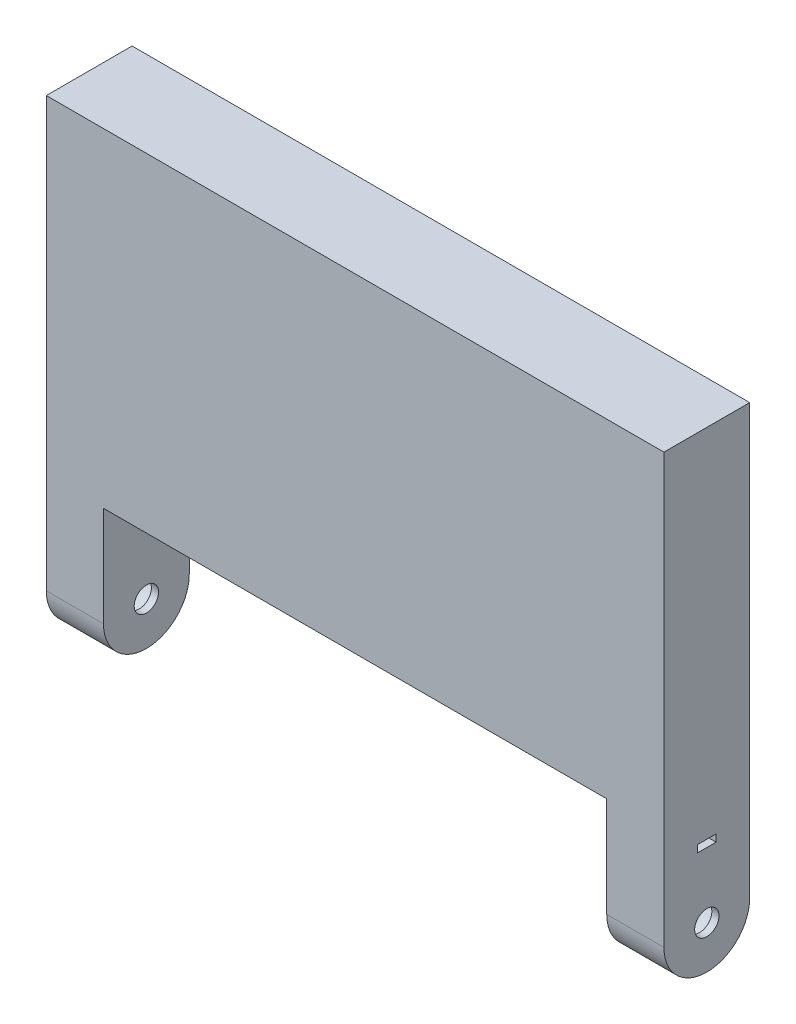
ISO-10303-21;
HEADER;
FILE_DESCRIPTION(('STEP AP214'),'2;1');
FILE_NAME('part.step','',(''),(''),'','','');
FILE_SCHEMA(('AUTOMOTIVE_DESIGN { 1 0 10303 214 1 1 1 1 }'));
ENDSEC;
DATA;
#1=APPLICATION_CONTEXT('core data for automotive mechanical design processes');
#2=APPLICATION_PROTOCOL_DEFINITION('international standard','automotive_design',2000,#1);
#3=PRODUCT_CONTEXT('',#1,'mechanical');
#4=PRODUCT('Part','Part','',(#3));
#5=PRODUCT_RELATED_PRODUCT_CATEGORY('part','',(#4));
#6=PRODUCT_DEFINITION_FORMATION('','',#4);
#7=PRODUCT_DEFINITION_CONTEXT('part definition',#1,'design');
#8=PRODUCT_DEFINITION('design','',#6,#7);
#9=PRODUCT_DEFINITION_SHAPE('','',#8);
#10=(LENGTH_UNIT() NAMED_UNIT(*) SI_UNIT(.MILLI.,.METRE.));
#11=(NAMED_UNIT(*) PLANE_ANGLE_UNIT() SI_UNIT($,.RADIAN.));
#12=(NAMED_UNIT(*) SI_UNIT($,.STERADIAN.) SOLID_ANGLE_UNIT());
#13=UNCERTAINTY_MEASURE_WITH_UNIT(LENGTH_MEASURE(1.E-05),#10,'distance_accuracy_value','');
#14=(GEOMETRIC_REPRESENTATION_CONTEXT(3) GLOBAL_UNCERTAINTY_ASSIGNED_CONTEXT((#13)) GLOBAL_UNIT_ASSIGNED_CONTEXT((#10,
#11,#12)) REPRESENTATION_CONTEXT('',''));
#15=CARTESIAN_POINT('',(0.,0.,0.));
#16=DIRECTION('',(0.,0.,1.));
#17=DIRECTION('',(1.,0.,0.));
#18=AXIS2_PLACEMENT_3D('',#15,#16,#17);
#19=CARTESIAN_POINT('',(-176.,0.,0.));
#20=DIRECTION('',(1.,0.,0.));
#21=DIRECTION('',(0.,0.,-1.));
#22=AXIS2_PLACEMENT_3D('',#19,#20,#21);
#23=PLANE('',#22);
#24=CARTESIAN_POINT('',(-176.,0.,0.));
#25=DIRECTION('',(1.,0.,0.));
#26=DIRECTION('',(0.,0.,-1.));
#27=AXIS2_PLACEMENT_3D('',#24,#25,#26);
#28=CIRCLE('',#27,8.5);
#29=CARTESIAN_POINT('',(-176.,0.,-8.5));
#30=VERTEX_POINT('',#29);
#31=EDGE_CURVE('E313',#30,#30,#28,.T.);
#32=ORIENTED_EDGE('',*,*,#31,.F.);
#33=EDGE_LOOP('',(#32));
#34=FACE_BOUND('',#33,.T.);
#35=DIRECTION('',(0.,-1.,0.));
#36=VECTOR('',#35,1.);
#37=CARTESIAN_POINT('',(-176.,0.,-30.));
#38=LINE('',#37,#36);
#39=CARTESIAN_POINT('',(-176.,70.,-30.));
#40=VERTEX_POINT('',#39);
#41=CARTESIAN_POINT('',(-176.,0.,-30.));
#42=VERTEX_POINT('',#41);
#43=EDGE_CURVE('E322',#40,#42,#38,.T.);
#44=ORIENTED_EDGE('',*,*,#43,.F.);
#45=DIRECTION('',(0.,0.,1.));
#46=VECTOR('',#45,1.);
#47=CARTESIAN_POINT('',(-176.,70.,0.));
#48=LINE('',#47,#46);
#49=CARTESIAN_POINT('',(-176.,70.,30.));
#50=VERTEX_POINT('',#49);
#51=EDGE_CURVE('E202',#40,#50,#48,.T.);
#52=ORIENTED_EDGE('',*,*,#51,.T.);
#53=DIRECTION('',(0.,1.,0.));
#54=VECTOR('',#53,1.);
#55=CARTESIAN_POINT('',(-176.,0.,30.));
#56=LINE('',#55,#54);
#57=CARTESIAN_POINT('',(-176.,0.,30.));
#58=VERTEX_POINT('',#57);
#59=EDGE_CURVE('E324',#58,#50,#56,.T.);
#60=ORIENTED_EDGE('',*,*,#59,.F.);
#61=CARTESIAN_POINT('',(-176.,0.,0.));
#62=DIRECTION('',(1.,0.,0.));
#63=DIRECTION('',(0.,0.,-1.));
#64=AXIS2_PLACEMENT_3D('',#61,#62,#63);
#65=CIRCLE('',#64,30.);
#66=EDGE_CURVE('E319',#58,#42,#65,.T.);
#67=ORIENTED_EDGE('',*,*,#66,.T.);
#68=EDGE_LOOP('',(#44,#52,#60,#67));
#69=FACE_BOUND('',#68,.T.);
#70=ADVANCED_FACE('F35',(#34,#69),#23,.T.);
#71=CARTESIAN_POINT('',(-211.,0.,0.));
#72=DIRECTION('',(1.,0.,0.));
#73=DIRECTION('',(0.,0.,-1.));
#74=AXIS2_PLACEMENT_3D('',#71,#72,#73);
#75=PLANE('',#74);
#76=CARTESIAN_POINT('',(-211.,0.,0.));
#77=DIRECTION('',(1.,0.,0.));
#78=DIRECTION('',(0.,0.,-1.));
#79=AXIS2_PLACEMENT_3D('',#76,#77,#78);
#80=CIRCLE('',#79,8.5);
#81=CARTESIAN_POINT('',(-211.,0.,-8.5));
#82=VERTEX_POINT('',#81);
#83=EDGE_CURVE('E310',#82,#82,#80,.T.);
#84=ORIENTED_EDGE('',*,*,#83,.F.);
#85=EDGE_LOOP('',(#84));
#86=FACE_BOUND('',#85,.T.);
#87=DIRECTION('',(0.,-1.,0.));
#88=VECTOR('',#87,1.);
#89=CARTESIAN_POINT('',(-211.,0.,6.50000000000001));
#90=LINE('',#89,#88);
#91=CARTESIAN_POINT('',(-211.,50.5,6.50000000000001));
#92=VERTEX_POINT('',#91);
#93=CARTESIAN_POINT('',(-211.,45.5,6.50000000000001));
#94=VERTEX_POINT('',#93);
#95=EDGE_CURVE('E362',#92,#94,#90,.T.);
#96=ORIENTED_EDGE('',*,*,#95,.F.);
#97=DIRECTION('',(0.,0.,1.));
#98=VECTOR('',#97,1.);
#99=CARTESIAN_POINT('',(-211.,50.5,0.));
#100=LINE('',#99,#98);
#101=CARTESIAN_POINT('',(-211.,50.5,-6.49999999999999));
#102=VERTEX_POINT('',#101);
#103=EDGE_CURVE('E365',#102,#92,#100,.T.);
#104=ORIENTED_EDGE('',*,*,#103,.F.);
#105=DIRECTION('',(0.,-1.,0.));
#106=VECTOR('',#105,1.);
#107=CARTESIAN_POINT('',(-211.,0.,-6.49999999999999));
#108=LINE('',#107,#106);
#109=CARTESIAN_POINT('',(-211.,45.5,-6.49999999999999));
#110=VERTEX_POINT('',#109);
#111=EDGE_CURVE('E369',#102,#110,#108,.T.);
#112=ORIENTED_EDGE('',*,*,#111,.T.);
#113=DIRECTION('',(0.,0.,1.));
#114=VECTOR('',#113,1.);
#115=CARTESIAN_POINT('',(-211.,45.5,0.));
#116=LINE('',#115,#114);
#117=EDGE_CURVE('E372',#110,#94,#116,.T.);
#118=ORIENTED_EDGE('',*,*,#117,.T.);
#119=EDGE_LOOP('',(#96,#104,#112,#118));
#120=FACE_BOUND('',#119,.T.);
#121=CARTESIAN_POINT('',(-211.,0.,0.));
#122=DIRECTION('',(1.,0.,0.));
#123=DIRECTION('',(0.,0.,-1.));
#124=AXIS2_PLACEMENT_3D('',#121,#122,#123);
#125=CIRCLE('',#124,25.);
#126=CARTESIAN_POINT('',(-211.,0.,25.));
#127=VERTEX_POINT('',#126);
#128=CARTESIAN_POINT('',(-211.,0.,-25.));
#129=VERTEX_POINT('',#128);
#130=EDGE_CURVE('E346',#127,#129,#125,.T.);
#131=ORIENTED_EDGE('',*,*,#130,.T.);
#132=DIRECTION('',(0.,-1.,0.));
#133=VECTOR('',#132,1.);
#134=CARTESIAN_POINT('',(-211.,0.,-25.));
#135=LINE('',#134,#133);
#136=CARTESIAN_POINT('',(-211.,295.,-25.));
#137=VERTEX_POINT('',#136);
#138=EDGE_CURVE('E334',#137,#129,#135,.T.);
#139=ORIENTED_EDGE('',*,*,#138,.F.);
#140=DIRECTION('',(0.,0.,-1.));
#141=VECTOR('',#140,1.);
#142=CARTESIAN_POINT('',(-211.,295.,0.));
#143=LINE('',#142,#141);
#144=CARTESIAN_POINT('',(-211.,295.,25.));
#145=VERTEX_POINT('',#144);
#146=EDGE_CURVE('E339',#145,#137,#143,.T.);
#147=ORIENTED_EDGE('',*,*,#146,.F.);
#148=DIRECTION('',(0.,1.,0.));
#149=VECTOR('',#148,1.);
#150=CARTESIAN_POINT('',(-211.,0.,25.));
#151=LINE('',#150,#149);
#152=EDGE_CURVE('E349',#127,#145,#151,.T.);
#153=ORIENTED_EDGE('',*,*,#152,.F.);
#154=EDGE_LOOP('',(#131,#139,#147,#153));
#155=FACE_BOUND('',#154,.T.);
#156=ADVANCED_FACE('F432',(#86,#120,#155),#75,.T.);
#157=CARTESIAN_POINT('',(-211.,0.,6.50000000000001));
#158=DIRECTION('',(0.,0.,-1.));
#159=DIRECTION('',(0.,1.,0.));
#160=AXIS2_PLACEMENT_3D('',#157,#158,#159);
#161=PLANE('',#160);
#162=DIRECTION('',(0.,-1.,0.));
#163=VECTOR('',#162,1.);
#164=CARTESIAN_POINT('',(-216.,0.,6.50000000000001));
#165=LINE('',#164,#163);
#166=CARTESIAN_POINT('',(-216.,50.5,6.50000000000001));
#167=VERTEX_POINT('',#166);
#168=CARTESIAN_POINT('',(-216.,45.5,6.50000000000001));
#169=VERTEX_POINT('',#168);
#170=EDGE_CURVE('E386',#167,#169,#165,.T.);
#171=ORIENTED_EDGE('',*,*,#170,.F.);
#172=DIRECTION('',(-1.,0.,0.));
#173=VECTOR('',#172,1.);
#174=CARTESIAN_POINT('',(-211.,50.5,6.50000000000001));
#175=LINE('',#174,#173);
#176=EDGE_CURVE('E11',#92,#167,#175,.T.);
#177=ORIENTED_EDGE('',*,*,#176,.F.);
#178=ORIENTED_EDGE('',*,*,#95,.T.);
#179=DIRECTION('',(-1.,0.,0.));
#180=VECTOR('',#179,1.);
#181=CARTESIAN_POINT('',(-211.,45.5,6.50000000000001));
#182=LINE('',#181,#180);
#183=EDGE_CURVE('E397',#94,#169,#182,.T.);
#184=ORIENTED_EDGE('',*,*,#183,.T.);
#185=EDGE_LOOP('',(#171,#177,#178,#184));
#186=FACE_BOUND('',#185,.T.);
#187=ADVANCED_FACE('F438',(#186),#161,.T.);
#188=CARTESIAN_POINT('',(-211.,50.5,0.));
#189=DIRECTION('',(0.,-1.,0.));
#190=DIRECTION('',(0.,0.,-1.));
#191=AXIS2_PLACEMENT_3D('',#188,#189,#190);
#192=PLANE('',#191);
#193=DIRECTION('',(0.,0.,1.));
#194=VECTOR('',#193,1.);
#195=CARTESIAN_POINT('',(-216.,50.5,0.));
#196=LINE('',#195,#194);
#197=CARTESIAN_POINT('',(-216.,50.5,-6.49999999999999));
#198=VERTEX_POINT('',#197);
#199=EDGE_CURVE('E389',#198,#167,#196,.T.);
#200=ORIENTED_EDGE('',*,*,#199,.F.);
#201=DIRECTION('',(-1.,0.,0.));
#202=VECTOR('',#201,1.);
#203=CARTESIAN_POINT('',(-211.,50.5,-6.49999999999999));
#204=LINE('',#203,#202);
#205=EDGE_CURVE('E44',#102,#198,#204,.T.);
#206=ORIENTED_EDGE('',*,*,#205,.F.);
#207=ORIENTED_EDGE('',*,*,#103,.T.);
#208=ORIENTED_EDGE('',*,*,#176,.T.);
#209=EDGE_LOOP('',(#200,#206,#207,#208));
#210=FACE_BOUND('',#209,.T.);
#211=ADVANCED_FACE('F479',(#210),#192,.T.);
#212=CARTESIAN_POINT('',(-211.,0.,-6.49999999999999));
#213=DIRECTION('',(0.,0.,-1.));
#214=DIRECTION('',(-1.,0.,0.));
#215=AXIS2_PLACEMENT_3D('',#212,#213,#214);
#216=PLANE('',#215);
#217=DIRECTION('',(0.,-1.,0.));
#218=VECTOR('',#217,1.);
#219=CARTESIAN_POINT('',(-216.,0.,-6.49999999999999));
#220=LINE('',#219,#218);
#221=CARTESIAN_POINT('',(-216.,45.5,-6.49999999999999));
#222=VERTEX_POINT('',#221);
#223=EDGE_CURVE('E392',#198,#222,#220,.T.);
#224=ORIENTED_EDGE('',*,*,#223,.T.);
#225=DIRECTION('',(-1.,0.,0.));
#226=VECTOR('',#225,1.);
#227=CARTESIAN_POINT('',(-211.,45.5,-6.49999999999999));
#228=LINE('',#227,#226);
#229=EDGE_CURVE('E399',#110,#222,#228,.T.);
#230=ORIENTED_EDGE('',*,*,#229,.F.);
#231=ORIENTED_EDGE('',*,*,#111,.F.);
#232=ORIENTED_EDGE('',*,*,#205,.T.);
#233=EDGE_LOOP('',(#224,#230,#231,#232));
#234=FACE_BOUND('',#233,.T.);
#235=ADVANCED_FACE('F476',(#234),#216,.F.);
#236=CARTESIAN_POINT('',(-211.,0.,0.));
#237=DIRECTION('',(-1.,0.,0.));
#238=DIRECTION('',(0.,0.,1.));
#239=AXIS2_PLACEMENT_3D('',#236,#237,#238);
#240=CYLINDRICAL_SURFACE('',#239,30.);
#241=CARTESIAN_POINT('',(-216.,0.,0.));
#242=DIRECTION('',(1.,0.,0.));
#243=DIRECTION('',(0.,0.,-1.));
#244=AXIS2_PLACEMENT_3D('',#241,#242,#243);
#245=CIRCLE('',#244,30.);
#246=CARTESIAN_POINT('',(-216.,0.,30.));
#247=VERTEX_POINT('',#246);
#248=CARTESIAN_POINT('',(-216.,0.,-30.));
#249=VERTEX_POINT('',#248);
#250=EDGE_CURVE('E361',#247,#249,#245,.T.);
#251=ORIENTED_EDGE('',*,*,#250,.T.);
#252=DIRECTION('',(-1.,0.,0.));
#253=VECTOR('',#252,1.);
#254=CARTESIAN_POINT('',(-211.,0.,-30.));
#255=LINE('',#254,#253);
#256=EDGE_CURVE('E400',#42,#249,#255,.T.);
#257=ORIENTED_EDGE('',*,*,#256,.F.);
#258=ORIENTED_EDGE('',*,*,#66,.F.);
#259=DIRECTION('',(-1.,0.,0.));
#260=VECTOR('',#259,1.);
#261=CARTESIAN_POINT('',(-211.,0.,30.));
#262=LINE('',#261,#260);
#263=EDGE_CURVE('E374',#58,#247,#262,.T.);
#264=ORIENTED_EDGE('',*,*,#263,.T.);
#265=EDGE_LOOP('',(#251,#257,#258,#264));
#266=FACE_BOUND('',#265,.T.);
#267=ADVANCED_FACE('F37',(#266),#240,.T.);
#268=CARTESIAN_POINT('',(-211.,0.,-30.));
#269=DIRECTION('',(0.,0.,-1.));
#270=DIRECTION('',(-1.,0.,0.));
#271=AXIS2_PLACEMENT_3D('',#268,#269,#270);
#272=PLANE('',#271);
#273=DIRECTION('',(0.,-1.,0.));
#274=VECTOR('',#273,1.);
#275=CARTESIAN_POINT('',(-216.,0.,-30.));
#276=LINE('',#275,#274);
#277=CARTESIAN_POINT('',(-216.,300.,-30.));
#278=VERTEX_POINT('',#277);
#279=EDGE_CURVE('E377',#278,#249,#276,.T.);
#280=ORIENTED_EDGE('',*,*,#279,.F.);
#281=DIRECTION('',(-1.,0.,0.));
#282=VECTOR('',#281,1.);
#283=CARTESIAN_POINT('',(-211.,300.,-30.));
#284=LINE('',#283,#282);
#285=CARTESIAN_POINT('',(216.,300.,-30.));
#286=VERTEX_POINT('',#285);
#287=EDGE_CURVE('E407',#286,#278,#284,.T.);
#288=ORIENTED_EDGE('',*,*,#287,.F.);
#289=DIRECTION('',(0.,-1.,0.));
#290=VECTOR('',#289,1.);
#291=CARTESIAN_POINT('',(216.,0.,-30.));
#292=LINE('',#291,#290);
#293=CARTESIAN_POINT('',(216.,0.,-30.));
#294=VERTEX_POINT('',#293);
#295=EDGE_CURVE('E270',#286,#294,#292,.T.);
#296=ORIENTED_EDGE('',*,*,#295,.T.);
#297=DIRECTION('',(1.,0.,0.));
#298=VECTOR('',#297,1.);
#299=CARTESIAN_POINT('',(211.,0.,-30.));
#300=LINE('',#299,#298);
#301=CARTESIAN_POINT('',(176.,0.,-30.));
#302=VERTEX_POINT('',#301);
#303=EDGE_CURVE('E220',#302,#294,#300,.T.);
#304=ORIENTED_EDGE('',*,*,#303,.F.);
#305=DIRECTION('',(0.,-1.,0.));
#306=VECTOR('',#305,1.);
#307=CARTESIAN_POINT('',(176.,0.,-30.));
#308=LINE('',#307,#306);
#309=CARTESIAN_POINT('',(176.,70.,-30.));
#310=VERTEX_POINT('',#309);
#311=EDGE_CURVE('E211',#310,#302,#308,.T.);
#312=ORIENTED_EDGE('',*,*,#311,.F.);
#313=DIRECTION('',(-1.,0.,0.));
#314=VECTOR('',#313,1.);
#315=CARTESIAN_POINT('',(237.697286480094,70.,-30.));
#316=LINE('',#315,#314);
#317=EDGE_CURVE('E197',#310,#40,#316,.T.);
#318=ORIENTED_EDGE('',*,*,#317,.T.);
#319=ORIENTED_EDGE('',*,*,#43,.T.);
#320=ORIENTED_EDGE('',*,*,#256,.T.);
#321=EDGE_LOOP('',(#280,#288,#296,#304,#312,#318,#319,#320));
#322=FACE_BOUND('',#321,.T.);
#323=ADVANCED_FACE('F218',(#322),#272,.T.);
#324=CARTESIAN_POINT('',(-211.,300.,0.));
#325=DIRECTION('',(0.,1.,0.));
#326=DIRECTION('',(0.,0.,1.));
#327=AXIS2_PLACEMENT_3D('',#324,#325,#326);
#328=PLANE('',#327);
#329=DIRECTION('',(0.,0.,-1.));
#330=VECTOR('',#329,1.);
#331=CARTESIAN_POINT('',(-216.,300.,0.));
#332=LINE('',#331,#330);
#333=CARTESIAN_POINT('',(-216.,300.,30.));
#334=VERTEX_POINT('',#333);
#335=EDGE_CURVE('E380',#334,#278,#332,.T.);
#336=ORIENTED_EDGE('',*,*,#335,.F.);
#337=DIRECTION('',(-1.,0.,0.));
#338=VECTOR('',#337,1.);
#339=CARTESIAN_POINT('',(-211.,300.,30.));
#340=LINE('',#339,#338);
#341=CARTESIAN_POINT('',(216.,300.,30.));
#342=VERTEX_POINT('',#341);
#343=EDGE_CURVE('E405',#342,#334,#340,.T.);
#344=ORIENTED_EDGE('',*,*,#343,.F.);
#345=DIRECTION('',(0.,0.,-1.));
#346=VECTOR('',#345,1.);
#347=CARTESIAN_POINT('',(216.,300.,0.));
#348=LINE('',#347,#346);
#349=EDGE_CURVE('E272',#342,#286,#348,.T.);
#350=ORIENTED_EDGE('',*,*,#349,.T.);
#351=ORIENTED_EDGE('',*,*,#287,.T.);
#352=EDGE_LOOP('',(#336,#344,#350,#351));
#353=FACE_BOUND('',#352,.T.);
#354=ADVANCED_FACE('F418',(#353),#328,.T.);
#355=CARTESIAN_POINT('',(-211.,0.,30.));
#356=DIRECTION('',(0.,0.,1.));
#357=DIRECTION('',(1.,0.,0.));
#358=AXIS2_PLACEMENT_3D('',#355,#356,#357);
#359=PLANE('',#358);
#360=DIRECTION('',(0.,1.,0.));
#361=VECTOR('',#360,1.);
#362=CARTESIAN_POINT('',(-216.,0.,30.));
#363=LINE('',#362,#361);
#364=EDGE_CURVE('E383',#247,#334,#363,.T.);
#365=ORIENTED_EDGE('',*,*,#364,.F.);
#366=ORIENTED_EDGE('',*,*,#263,.F.);
#367=ORIENTED_EDGE('',*,*,#59,.T.);
#368=DIRECTION('',(-1.,0.,0.));
#369=VECTOR('',#368,1.);
#370=CARTESIAN_POINT('',(237.697286480094,70.,30.));
#371=LINE('',#370,#369);
#372=CARTESIAN_POINT('',(176.,70.,30.));
#373=VERTEX_POINT('',#372);
#374=EDGE_CURVE('E52',#373,#50,#371,.T.);
#375=ORIENTED_EDGE('',*,*,#374,.F.);
#376=DIRECTION('',(0.,1.,0.));
#377=VECTOR('',#376,1.);
#378=CARTESIAN_POINT('',(176.,0.,30.));
#379=LINE('',#378,#377);
#380=CARTESIAN_POINT('',(176.,0.,30.));
#381=VERTEX_POINT('',#380);
#382=EDGE_CURVE('E213',#381,#373,#379,.T.);
#383=ORIENTED_EDGE('',*,*,#382,.F.);
#384=DIRECTION('',(1.,0.,0.));
#385=VECTOR('',#384,1.);
#386=CARTESIAN_POINT('',(211.,0.,30.));
#387=LINE('',#386,#385);
#388=CARTESIAN_POINT('',(216.,0.,30.));
#389=VERTEX_POINT('',#388);
#390=EDGE_CURVE('E267',#381,#389,#387,.T.);
#391=ORIENTED_EDGE('',*,*,#390,.T.);
#392=DIRECTION('',(0.,1.,0.));
#393=VECTOR('',#392,1.);
#394=CARTESIAN_POINT('',(216.,0.,30.));
#395=LINE('',#394,#393);
#396=EDGE_CURVE('E275',#389,#342,#395,.T.);
#397=ORIENTED_EDGE('',*,*,#396,.T.);
#398=ORIENTED_EDGE('',*,*,#343,.T.);
#399=EDGE_LOOP('',(#365,#366,#367,#375,#383,#391,#397,#398));
#400=FACE_BOUND('',#399,.T.);
#401=ADVANCED_FACE('F428',(#400),#359,.T.);
#402=CARTESIAN_POINT('',(-211.,45.5,0.));
#403=DIRECTION('',(0.,-1.,0.));
#404=DIRECTION('',(0.,0.,-1.));
#405=AXIS2_PLACEMENT_3D('',#402,#403,#404);
#406=PLANE('',#405);
#407=DIRECTION('',(0.,0.,1.));
#408=VECTOR('',#407,1.);
#409=CARTESIAN_POINT('',(-216.,45.5,0.));
#410=LINE('',#409,#408);
#411=EDGE_CURVE('E366',#222,#169,#410,.T.);
#412=ORIENTED_EDGE('',*,*,#411,.T.);
#413=ORIENTED_EDGE('',*,*,#183,.F.);
#414=ORIENTED_EDGE('',*,*,#117,.F.);
#415=ORIENTED_EDGE('',*,*,#229,.T.);
#416=EDGE_LOOP('',(#412,#413,#414,#415));
#417=FACE_BOUND('',#416,.T.);
#418=ADVANCED_FACE('F471',(#417),#406,.F.);
#419=CARTESIAN_POINT('',(-216.,0.,0.));
#420=DIRECTION('',(1.,0.,0.));
#421=DIRECTION('',(0.,0.,-1.));
#422=AXIS2_PLACEMENT_3D('',#419,#420,#421);
#423=PLANE('',#422);
#424=CARTESIAN_POINT('',(-216.,0.,0.));
#425=DIRECTION('',(1.,0.,0.));
#426=DIRECTION('',(0.,0.,-1.));
#427=AXIS2_PLACEMENT_3D('',#424,#425,#426);
#428=CIRCLE('',#427,8.5);
#429=CARTESIAN_POINT('',(-216.,0.,-8.5));
#430=VERTEX_POINT('',#429);
#431=EDGE_CURVE('E299',#430,#430,#428,.T.);
#432=ORIENTED_EDGE('',*,*,#431,.T.);
#433=EDGE_LOOP('',(#432));
#434=FACE_BOUND('',#433,.T.);
#435=ORIENTED_EDGE('',*,*,#250,.F.);
#436=ORIENTED_EDGE('',*,*,#364,.T.);
#437=ORIENTED_EDGE('',*,*,#335,.T.);
#438=ORIENTED_EDGE('',*,*,#279,.T.);
#439=EDGE_LOOP('',(#435,#436,#437,#438));
#440=FACE_BOUND('',#439,.T.);
#441=ORIENTED_EDGE('',*,*,#170,.T.);
#442=ORIENTED_EDGE('',*,*,#411,.F.);
#443=ORIENTED_EDGE('',*,*,#223,.F.);
#444=ORIENTED_EDGE('',*,*,#199,.T.);
#445=EDGE_LOOP('',(#441,#442,#443,#444));
#446=FACE_BOUND('',#445,.T.);
#447=ADVANCED_FACE('F414',(#434,#440,#446),#423,.F.);
#448=CARTESIAN_POINT('',(-181.,0.,-25.));
#449=DIRECTION('',(0.,0.,-1.));
#450=DIRECTION('',(0.,1.,0.));
#451=AXIS2_PLACEMENT_3D('',#448,#449,#450);
#452=PLANE('',#451);
#453=ORIENTED_EDGE('',*,*,#138,.T.);
#454=DIRECTION('',(-1.,0.,0.));
#455=VECTOR('',#454,1.);
#456=CARTESIAN_POINT('',(-181.,0.,-25.));
#457=LINE('',#456,#455);
#458=CARTESIAN_POINT('',(-181.,0.,-25.));
#459=VERTEX_POINT('',#458);
#460=EDGE_CURVE('E359',#459,#129,#457,.T.);
#461=ORIENTED_EDGE('',*,*,#460,.F.);
#462=DIRECTION('',(0.,-1.,0.));
#463=VECTOR('',#462,1.);
#464=CARTESIAN_POINT('',(-181.,0.,-25.));
#465=LINE('',#464,#463);
#466=CARTESIAN_POINT('',(-181.,75.,-25.));
#467=VERTEX_POINT('',#466);
#468=EDGE_CURVE('E335',#467,#459,#465,.T.);
#469=ORIENTED_EDGE('',*,*,#468,.F.);
#470=DIRECTION('',(-1.,0.,0.));
#471=VECTOR('',#470,1.);
#472=CARTESIAN_POINT('',(-176.,75.,-25.));
#473=LINE('',#472,#471);
#474=CARTESIAN_POINT('',(181.,75.,-25.));
#475=VERTEX_POINT('',#474);
#476=EDGE_CURVE('E331',#475,#467,#473,.T.);
#477=ORIENTED_EDGE('',*,*,#476,.F.);
#478=DIRECTION('',(0.,-1.,0.));
#479=VECTOR('',#478,1.);
#480=CARTESIAN_POINT('',(181.,0.,-25.));
#481=LINE('',#480,#479);
#482=CARTESIAN_POINT('',(181.,0.,-25.));
#483=VERTEX_POINT('',#482);
#484=EDGE_CURVE('E230',#475,#483,#481,.T.);
#485=ORIENTED_EDGE('',*,*,#484,.T.);
#486=DIRECTION('',(1.,0.,0.));
#487=VECTOR('',#486,1.);
#488=CARTESIAN_POINT('',(181.,0.,-25.));
#489=LINE('',#488,#487);
#490=CARTESIAN_POINT('',(211.,0.,-25.));
#491=VERTEX_POINT('',#490);
#492=EDGE_CURVE('E251',#483,#491,#489,.T.);
#493=ORIENTED_EDGE('',*,*,#492,.T.);
#494=DIRECTION('',(0.,-1.,0.));
#495=VECTOR('',#494,1.);
#496=CARTESIAN_POINT('',(211.,0.,-25.));
#497=LINE('',#496,#495);
#498=CARTESIAN_POINT('',(211.,295.,-25.));
#499=VERTEX_POINT('',#498);
#500=EDGE_CURVE('E224',#499,#491,#497,.T.);
#501=ORIENTED_EDGE('',*,*,#500,.F.);
#502=DIRECTION('',(-1.,0.,0.));
#503=VECTOR('',#502,1.);
#504=CARTESIAN_POINT('',(-181.,295.,-25.));
#505=LINE('',#504,#503);
#506=EDGE_CURVE('E343',#499,#137,#505,.T.);
#507=ORIENTED_EDGE('',*,*,#506,.T.);
#508=EDGE_LOOP('',(#453,#461,#469,#477,#485,#493,#501,#507));
#509=FACE_BOUND('',#508,.T.);
#510=ADVANCED_FACE('F464',(#509),#452,.F.);
#511=CARTESIAN_POINT('',(-181.,0.,0.));
#512=DIRECTION('',(-1.,0.,0.));
#513=DIRECTION('',(0.,0.,1.));
#514=AXIS2_PLACEMENT_3D('',#511,#512,#513);
#515=CYLINDRICAL_SURFACE('',#514,25.);
#516=ORIENTED_EDGE('',*,*,#130,.F.);
#517=DIRECTION('',(-1.,0.,0.));
#518=VECTOR('',#517,1.);
#519=CARTESIAN_POINT('',(-181.,0.,25.));
#520=LINE('',#519,#518);
#521=CARTESIAN_POINT('',(-181.,0.,25.));
#522=VERTEX_POINT('',#521);
#523=EDGE_CURVE('E357',#522,#127,#520,.T.);
#524=ORIENTED_EDGE('',*,*,#523,.F.);
#525=CARTESIAN_POINT('',(-181.,0.,0.));
#526=DIRECTION('',(1.,0.,0.));
#527=DIRECTION('',(0.,0.,-1.));
#528=AXIS2_PLACEMENT_3D('',#525,#526,#527);
#529=CIRCLE('',#528,25.);
#530=EDGE_CURVE('E338',#522,#459,#529,.T.);
#531=ORIENTED_EDGE('',*,*,#530,.T.);
#532=ORIENTED_EDGE('',*,*,#460,.T.);
#533=EDGE_LOOP('',(#516,#524,#531,#532));
#534=FACE_BOUND('',#533,.T.);
#535=ADVANCED_FACE('F460',(#534),#515,.F.);
#536=CARTESIAN_POINT('',(-181.,0.,25.));
#537=DIRECTION('',(0.,0.,1.));
#538=DIRECTION('',(1.,0.,0.));
#539=AXIS2_PLACEMENT_3D('',#536,#537,#538);
#540=PLANE('',#539);
#541=ORIENTED_EDGE('',*,*,#152,.T.);
#542=DIRECTION('',(-1.,0.,0.));
#543=VECTOR('',#542,1.);
#544=CARTESIAN_POINT('',(-181.,295.,25.));
#545=LINE('',#544,#543);
#546=CARTESIAN_POINT('',(211.,295.,25.));
#547=VERTEX_POINT('',#546);
#548=EDGE_CURVE('E355',#547,#145,#545,.T.);
#549=ORIENTED_EDGE('',*,*,#548,.F.);
#550=DIRECTION('',(0.,1.,0.));
#551=VECTOR('',#550,1.);
#552=CARTESIAN_POINT('',(211.,0.,25.));
#553=LINE('',#552,#551);
#554=CARTESIAN_POINT('',(211.,0.,25.));
#555=VERTEX_POINT('',#554);
#556=EDGE_CURVE('E245',#555,#547,#553,.T.);
#557=ORIENTED_EDGE('',*,*,#556,.F.);
#558=DIRECTION('',(1.,0.,0.));
#559=VECTOR('',#558,1.);
#560=CARTESIAN_POINT('',(181.,0.,25.));
#561=LINE('',#560,#559);
#562=CARTESIAN_POINT('',(181.,0.,25.));
#563=VERTEX_POINT('',#562);
#564=EDGE_CURVE('E239',#563,#555,#561,.T.);
#565=ORIENTED_EDGE('',*,*,#564,.F.);
#566=DIRECTION('',(0.,1.,0.));
#567=VECTOR('',#566,1.);
#568=CARTESIAN_POINT('',(181.,0.,25.));
#569=LINE('',#568,#567);
#570=CARTESIAN_POINT('',(181.,75.,25.));
#571=VERTEX_POINT('',#570);
#572=EDGE_CURVE('E236',#563,#571,#569,.T.);
#573=ORIENTED_EDGE('',*,*,#572,.T.);
#574=DIRECTION('',(-1.,0.,0.));
#575=VECTOR('',#574,1.);
#576=CARTESIAN_POINT('',(-176.,75.,25.));
#577=LINE('',#576,#575);
#578=CARTESIAN_POINT('',(-181.,75.,25.));
#579=VERTEX_POINT('',#578);
#580=EDGE_CURVE('E327',#571,#579,#577,.T.);
#581=ORIENTED_EDGE('',*,*,#580,.T.);
#582=DIRECTION('',(0.,1.,0.));
#583=VECTOR('',#582,1.);
#584=CARTESIAN_POINT('',(-181.,0.,25.));
#585=LINE('',#584,#583);
#586=EDGE_CURVE('E60',#522,#579,#585,.T.);
#587=ORIENTED_EDGE('',*,*,#586,.F.);
#588=ORIENTED_EDGE('',*,*,#523,.T.);
#589=EDGE_LOOP('',(#541,#549,#557,#565,#573,#581,#587,#588));
#590=FACE_BOUND('',#589,.T.);
#591=ADVANCED_FACE('F456',(#590),#540,.F.);
#592=CARTESIAN_POINT('',(-181.,295.,0.));
#593=DIRECTION('',(0.,1.,0.));
#594=DIRECTION('',(0.,0.,1.));
#595=AXIS2_PLACEMENT_3D('',#592,#593,#594);
#596=PLANE('',#595);
#597=ORIENTED_EDGE('',*,*,#146,.T.);
#598=ORIENTED_EDGE('',*,*,#506,.F.);
#599=DIRECTION('',(0.,0.,-1.));
#600=VECTOR('',#599,1.);
#601=CARTESIAN_POINT('',(211.,295.,0.));
#602=LINE('',#601,#600);
#603=EDGE_CURVE('E234',#547,#499,#602,.T.);
#604=ORIENTED_EDGE('',*,*,#603,.F.);
#605=ORIENTED_EDGE('',*,*,#548,.T.);
#606=EDGE_LOOP('',(#597,#598,#604,#605));
#607=FACE_BOUND('',#606,.T.);
#608=ADVANCED_FACE('F449',(#607),#596,.F.);
#609=CARTESIAN_POINT('',(-181.,0.,0.));
#610=DIRECTION('',(1.,0.,0.));
#611=DIRECTION('',(0.,0.,-1.));
#612=AXIS2_PLACEMENT_3D('',#609,#610,#611);
#613=PLANE('',#612);
#614=CARTESIAN_POINT('',(-181.,0.,0.));
#615=DIRECTION('',(1.,0.,0.));
#616=DIRECTION('',(0.,0.,-1.));
#617=AXIS2_PLACEMENT_3D('',#614,#615,#616);
#618=CIRCLE('',#617,8.5);
#619=CARTESIAN_POINT('',(-181.,0.,-8.5));
#620=VERTEX_POINT('',#619);
#621=EDGE_CURVE('E39',#620,#620,#618,.T.);
#622=ORIENTED_EDGE('',*,*,#621,.T.);
#623=EDGE_LOOP('',(#622));
#624=FACE_BOUND('',#623,.T.);
#625=DIRECTION('',(0.,0.,1.));
#626=VECTOR('',#625,1.);
#627=CARTESIAN_POINT('',(-181.,75.,0.));
#628=LINE('',#627,#626);
#629=EDGE_CURVE('E316',#467,#579,#628,.T.);
#630=ORIENTED_EDGE('',*,*,#629,.F.);
#631=ORIENTED_EDGE('',*,*,#468,.T.);
#632=ORIENTED_EDGE('',*,*,#530,.F.);
#633=ORIENTED_EDGE('',*,*,#586,.T.);
#634=EDGE_LOOP('',(#630,#631,#632,#633));
#635=FACE_BOUND('',#634,.T.);
#636=ADVANCED_FACE('F445',(#624,#635),#613,.F.);
#637=CARTESIAN_POINT('',(-176.,75.,0.));
#638=DIRECTION('',(0.,-1.,0.));
#639=DIRECTION('',(0.,0.,-1.));
#640=AXIS2_PLACEMENT_3D('',#637,#638,#639);
#641=PLANE('',#640);
#642=ORIENTED_EDGE('',*,*,#629,.T.);
#643=ORIENTED_EDGE('',*,*,#580,.F.);
#644=DIRECTION('',(0.,0.,1.));
#645=VECTOR('',#644,1.);
#646=CARTESIAN_POINT('',(181.,75.,0.));
#647=LINE('',#646,#645);
#648=EDGE_CURVE('E214',#475,#571,#647,.T.);
#649=ORIENTED_EDGE('',*,*,#648,.F.);
#650=ORIENTED_EDGE('',*,*,#476,.T.);
#651=EDGE_LOOP('',(#642,#643,#649,#650));
#652=FACE_BOUND('',#651,.T.);
#653=ADVANCED_FACE('F448',(#652),#641,.F.);
#654=CARTESIAN_POINT('',(237.697286480094,70.,0.));
#655=DIRECTION('',(0.,-1.,0.));
#656=DIRECTION('',(0.,0.,-1.));
#657=AXIS2_PLACEMENT_3D('',#654,#655,#656);
#658=PLANE('',#657);
#659=ORIENTED_EDGE('',*,*,#317,.F.);
#660=DIRECTION('',(0.,0.,1.));
#661=VECTOR('',#660,1.);
#662=CARTESIAN_POINT('',(176.,70.,0.));
#663=LINE('',#662,#661);
#664=EDGE_CURVE('E200',#310,#373,#663,.T.);
#665=ORIENTED_EDGE('',*,*,#664,.T.);
#666=ORIENTED_EDGE('',*,*,#374,.T.);
#667=ORIENTED_EDGE('',*,*,#51,.F.);
#668=EDGE_LOOP('',(#659,#665,#666,#667));
#669=FACE_BOUND('',#668,.T.);
#670=ADVANCED_FACE('F199',(#669),#658,.T.);
#671=CARTESIAN_POINT('',(-216.,0.,0.));
#672=DIRECTION('',(1.,0.,0.));
#673=DIRECTION('',(0.,0.,-1.));
#674=AXIS2_PLACEMENT_3D('',#671,#672,#673);
#675=CYLINDRICAL_SURFACE('',#674,8.5);
#676=ORIENTED_EDGE('',*,*,#31,.T.);
#677=EDGE_LOOP('',(#676));
#678=FACE_BOUND('',#677,.T.);
#679=ORIENTED_EDGE('',*,*,#621,.F.);
#680=EDGE_LOOP('',(#679));
#681=FACE_BOUND('',#680,.T.);
#682=ADVANCED_FACE('F645',(#678,#681),#675,.F.);
#683=ORIENTED_EDGE('',*,*,#83,.T.);
#684=EDGE_LOOP('',(#683));
#685=FACE_BOUND('',#684,.T.);
#686=ORIENTED_EDGE('',*,*,#431,.F.);
#687=EDGE_LOOP('',(#686));
#688=FACE_BOUND('',#687,.T.);
#689=ADVANCED_FACE('F640',(#685,#688),#675,.F.);
#690=CARTESIAN_POINT('',(176.,0.,0.));
#691=DIRECTION('',(-1.,0.,0.));
#692=DIRECTION('',(0.,0.,-1.));
#693=AXIS2_PLACEMENT_3D('',#690,#691,#692);
#694=PLANE('',#693);
#695=CARTESIAN_POINT('',(176.,0.,0.));
#696=DIRECTION('',(1.,0.,0.));
#697=DIRECTION('',(0.,0.,-1.));
#698=AXIS2_PLACEMENT_3D('',#695,#696,#697);
#699=CIRCLE('',#698,8.5);
#700=CARTESIAN_POINT('',(176.,0.,-8.5));
#701=VERTEX_POINT('',#700);
#702=EDGE_CURVE('E215',#701,#701,#699,.T.);
#703=ORIENTED_EDGE('',*,*,#702,.T.);
#704=EDGE_LOOP('',(#703));
#705=FACE_BOUND('',#704,.T.);
#706=ORIENTED_EDGE('',*,*,#311,.T.);
#707=CARTESIAN_POINT('',(176.,0.,0.));
#708=DIRECTION('',(1.,0.,0.));
#709=DIRECTION('',(0.,0.,-1.));
#710=AXIS2_PLACEMENT_3D('',#707,#708,#709);
#711=CIRCLE('',#710,30.);
#712=EDGE_CURVE('E222',#381,#302,#711,.T.);
#713=ORIENTED_EDGE('',*,*,#712,.F.);
#714=ORIENTED_EDGE('',*,*,#382,.T.);
#715=ORIENTED_EDGE('',*,*,#664,.F.);
#716=EDGE_LOOP('',(#706,#713,#714,#715));
#717=FACE_BOUND('',#716,.T.);
#718=ADVANCED_FACE('F209',(#705,#717),#694,.T.);
#719=CARTESIAN_POINT('',(211.,0.,0.));
#720=DIRECTION('',(-1.,0.,0.));
#721=DIRECTION('',(0.,0.,-1.));
#722=AXIS2_PLACEMENT_3D('',#719,#720,#721);
#723=PLANE('',#722);
#724=CARTESIAN_POINT('',(211.,0.,0.));
#725=DIRECTION('',(1.,0.,0.));
#726=DIRECTION('',(0.,0.,-1.));
#727=AXIS2_PLACEMENT_3D('',#724,#725,#726);
#728=CIRCLE('',#727,8.5);
#729=CARTESIAN_POINT('',(211.,0.,-8.5));
#730=VERTEX_POINT('',#729);
#731=EDGE_CURVE('E306',#730,#730,#728,.T.);
#732=ORIENTED_EDGE('',*,*,#731,.T.);
#733=EDGE_LOOP('',(#732));
#734=FACE_BOUND('',#733,.T.);
#735=DIRECTION('',(0.,-1.,0.));
#736=VECTOR('',#735,1.);
#737=CARTESIAN_POINT('',(211.,0.,6.50000000000001));
#738=LINE('',#737,#736);
#739=CARTESIAN_POINT('',(211.,50.5,6.50000000000001));
#740=VERTEX_POINT('',#739);
#741=CARTESIAN_POINT('',(211.,45.5,6.50000000000001));
#742=VERTEX_POINT('',#741);
#743=EDGE_CURVE('E254',#740,#742,#738,.T.);
#744=ORIENTED_EDGE('',*,*,#743,.T.);
#745=DIRECTION('',(0.,0.,1.));
#746=VECTOR('',#745,1.);
#747=CARTESIAN_POINT('',(211.,45.5,0.));
#748=LINE('',#747,#746);
#749=CARTESIAN_POINT('',(211.,45.5,-6.49999999999999));
#750=VERTEX_POINT('',#749);
#751=EDGE_CURVE('E264',#750,#742,#748,.T.);
#752=ORIENTED_EDGE('',*,*,#751,.F.);
#753=DIRECTION('',(0.,-1.,0.));
#754=VECTOR('',#753,1.);
#755=CARTESIAN_POINT('',(211.,0.,-6.49999999999999));
#756=LINE('',#755,#754);
#757=CARTESIAN_POINT('',(211.,50.5,-6.49999999999999));
#758=VERTEX_POINT('',#757);
#759=EDGE_CURVE('E261',#758,#750,#756,.T.);
#760=ORIENTED_EDGE('',*,*,#759,.F.);
#761=DIRECTION('',(0.,0.,1.));
#762=VECTOR('',#761,1.);
#763=CARTESIAN_POINT('',(211.,50.5,0.));
#764=LINE('',#763,#762);
#765=EDGE_CURVE('E257',#758,#740,#764,.T.);
#766=ORIENTED_EDGE('',*,*,#765,.T.);
#767=EDGE_LOOP('',(#744,#752,#760,#766));
#768=FACE_BOUND('',#767,.T.);
#769=CARTESIAN_POINT('',(211.,0.,0.));
#770=DIRECTION('',(1.,0.,0.));
#771=DIRECTION('',(0.,0.,-1.));
#772=AXIS2_PLACEMENT_3D('',#769,#770,#771);
#773=CIRCLE('',#772,25.);
#774=EDGE_CURVE('E242',#555,#491,#773,.T.);
#775=ORIENTED_EDGE('',*,*,#774,.F.);
#776=ORIENTED_EDGE('',*,*,#556,.T.);
#777=ORIENTED_EDGE('',*,*,#603,.T.);
#778=ORIENTED_EDGE('',*,*,#500,.T.);
#779=EDGE_LOOP('',(#775,#776,#777,#778));
#780=FACE_BOUND('',#779,.T.);
#781=ADVANCED_FACE('F733',(#734,#768,#780),#723,.T.);
#782=CARTESIAN_POINT('',(211.,0.,6.50000000000001));
#783=DIRECTION('',(0.,0.,-1.));
#784=DIRECTION('',(0.,1.,0.));
#785=AXIS2_PLACEMENT_3D('',#782,#783,#784);
#786=PLANE('',#785);
#787=DIRECTION('',(0.,-1.,0.));
#788=VECTOR('',#787,1.);
#789=CARTESIAN_POINT('',(216.,0.,6.50000000000001));
#790=LINE('',#789,#788);
#791=CARTESIAN_POINT('',(216.,50.5,6.50000000000001));
#792=VERTEX_POINT('',#791);
#793=CARTESIAN_POINT('',(216.,45.5,6.50000000000001));
#794=VERTEX_POINT('',#793);
#795=EDGE_CURVE('E278',#792,#794,#790,.T.);
#796=ORIENTED_EDGE('',*,*,#795,.T.);
#797=DIRECTION('',(1.,0.,0.));
#798=VECTOR('',#797,1.);
#799=CARTESIAN_POINT('',(211.,45.5,6.50000000000001));
#800=LINE('',#799,#798);
#801=EDGE_CURVE('E287',#742,#794,#800,.T.);
#802=ORIENTED_EDGE('',*,*,#801,.F.);
#803=ORIENTED_EDGE('',*,*,#743,.F.);
#804=DIRECTION('',(1.,0.,0.));
#805=VECTOR('',#804,1.);
#806=CARTESIAN_POINT('',(211.,50.5,6.50000000000001));
#807=LINE('',#806,#805);
#808=EDGE_CURVE('E296',#740,#792,#807,.T.);
#809=ORIENTED_EDGE('',*,*,#808,.T.);
#810=EDGE_LOOP('',(#796,#802,#803,#809));
#811=FACE_BOUND('',#810,.T.);
#812=ADVANCED_FACE('F741',(#811),#786,.T.);
#813=CARTESIAN_POINT('',(211.,50.5,0.));
#814=DIRECTION('',(0.,-1.,0.));
#815=DIRECTION('',(0.,0.,-1.));
#816=AXIS2_PLACEMENT_3D('',#813,#814,#815);
#817=PLANE('',#816);
#818=DIRECTION('',(0.,0.,1.));
#819=VECTOR('',#818,1.);
#820=CARTESIAN_POINT('',(216.,50.5,0.));
#821=LINE('',#820,#819);
#822=CARTESIAN_POINT('',(216.,50.5,-6.49999999999999));
#823=VERTEX_POINT('',#822);
#824=EDGE_CURVE('E281',#823,#792,#821,.T.);
#825=ORIENTED_EDGE('',*,*,#824,.T.);
#826=ORIENTED_EDGE('',*,*,#808,.F.);
#827=ORIENTED_EDGE('',*,*,#765,.F.);
#828=DIRECTION('',(1.,0.,0.));
#829=VECTOR('',#828,1.);
#830=CARTESIAN_POINT('',(211.,50.5,-6.49999999999999));
#831=LINE('',#830,#829);
#832=EDGE_CURVE('E293',#758,#823,#831,.T.);
#833=ORIENTED_EDGE('',*,*,#832,.T.);
#834=EDGE_LOOP('',(#825,#826,#827,#833));
#835=FACE_BOUND('',#834,.T.);
#836=ADVANCED_FACE('F749',(#835),#817,.T.);
#837=CARTESIAN_POINT('',(211.,0.,-6.49999999999999));
#838=DIRECTION('',(0.,0.,-1.));
#839=DIRECTION('',(1.,0.,0.));
#840=AXIS2_PLACEMENT_3D('',#837,#838,#839);
#841=PLANE('',#840);
#842=DIRECTION('',(0.,-1.,0.));
#843=VECTOR('',#842,1.);
#844=CARTESIAN_POINT('',(216.,0.,-6.49999999999999));
#845=LINE('',#844,#843);
#846=CARTESIAN_POINT('',(216.,45.5,-6.49999999999999));
#847=VERTEX_POINT('',#846);
#848=EDGE_CURVE('E283',#823,#847,#845,.T.);
#849=ORIENTED_EDGE('',*,*,#848,.F.);
#850=ORIENTED_EDGE('',*,*,#832,.F.);
#851=ORIENTED_EDGE('',*,*,#759,.T.);
#852=DIRECTION('',(1.,0.,0.));
#853=VECTOR('',#852,1.);
#854=CARTESIAN_POINT('',(211.,45.5,-6.49999999999999));
#855=LINE('',#854,#853);
#856=EDGE_CURVE('E290',#750,#847,#855,.T.);
#857=ORIENTED_EDGE('',*,*,#856,.T.);
#858=EDGE_LOOP('',(#849,#850,#851,#857));
#859=FACE_BOUND('',#858,.T.);
#860=ADVANCED_FACE('F757',(#859),#841,.F.);
#861=CARTESIAN_POINT('',(211.,0.,0.));
#862=DIRECTION('',(1.,0.,0.));
#863=DIRECTION('',(0.,0.,1.));
#864=AXIS2_PLACEMENT_3D('',#861,#862,#863);
#865=CYLINDRICAL_SURFACE('',#864,30.);
#866=CARTESIAN_POINT('',(216.,0.,0.));
#867=DIRECTION('',(1.,0.,0.));
#868=DIRECTION('',(0.,0.,-1.));
#869=AXIS2_PLACEMENT_3D('',#866,#867,#868);
#870=CIRCLE('',#869,30.);
#871=EDGE_CURVE('E253',#389,#294,#870,.T.);
#872=ORIENTED_EDGE('',*,*,#871,.F.);
#873=ORIENTED_EDGE('',*,*,#390,.F.);
#874=ORIENTED_EDGE('',*,*,#712,.T.);
#875=ORIENTED_EDGE('',*,*,#303,.T.);
#876=EDGE_LOOP('',(#872,#873,#874,#875));
#877=FACE_BOUND('',#876,.T.);
#878=ADVANCED_FACE('F424',(#877),#865,.T.);
#879=CARTESIAN_POINT('',(211.,45.5,0.));
#880=DIRECTION('',(0.,-1.,0.));
#881=DIRECTION('',(0.,0.,-1.));
#882=AXIS2_PLACEMENT_3D('',#879,#880,#881);
#883=PLANE('',#882);
#884=DIRECTION('',(0.,0.,1.));
#885=VECTOR('',#884,1.);
#886=CARTESIAN_POINT('',(216.,45.5,0.));
#887=LINE('',#886,#885);
#888=EDGE_CURVE('E258',#847,#794,#887,.T.);
#889=ORIENTED_EDGE('',*,*,#888,.F.);
#890=ORIENTED_EDGE('',*,*,#856,.F.);
#891=ORIENTED_EDGE('',*,*,#751,.T.);
#892=ORIENTED_EDGE('',*,*,#801,.T.);
#893=EDGE_LOOP('',(#889,#890,#891,#892));
#894=FACE_BOUND('',#893,.T.);
#895=ADVANCED_FACE('F772',(#894),#883,.F.);
#896=CARTESIAN_POINT('',(216.,0.,0.));
#897=DIRECTION('',(-1.,0.,0.));
#898=DIRECTION('',(0.,0.,-1.));
#899=AXIS2_PLACEMENT_3D('',#896,#897,#898);
#900=PLANE('',#899);
#901=CARTESIAN_POINT('',(216.,0.,0.));
#902=DIRECTION('',(1.,0.,0.));
#903=DIRECTION('',(0.,0.,-1.));
#904=AXIS2_PLACEMENT_3D('',#901,#902,#903);
#905=CIRCLE('',#904,8.5);
#906=CARTESIAN_POINT('',(216.,0.,-8.5));
#907=VERTEX_POINT('',#906);
#908=EDGE_CURVE('E307',#907,#907,#905,.T.);
#909=ORIENTED_EDGE('',*,*,#908,.F.);
#910=EDGE_LOOP('',(#909));
#911=FACE_BOUND('',#910,.T.);
#912=ORIENTED_EDGE('',*,*,#871,.T.);
#913=ORIENTED_EDGE('',*,*,#295,.F.);
#914=ORIENTED_EDGE('',*,*,#349,.F.);
#915=ORIENTED_EDGE('',*,*,#396,.F.);
#916=EDGE_LOOP('',(#912,#913,#914,#915));
#917=FACE_BOUND('',#916,.T.);
#918=ORIENTED_EDGE('',*,*,#795,.F.);
#919=ORIENTED_EDGE('',*,*,#824,.F.);
#920=ORIENTED_EDGE('',*,*,#848,.T.);
#921=ORIENTED_EDGE('',*,*,#888,.T.);
#922=EDGE_LOOP('',(#918,#919,#920,#921));
#923=FACE_BOUND('',#922,.T.);
#924=ADVANCED_FACE('F425',(#911,#917,#923),#900,.F.);
#925=CARTESIAN_POINT('',(181.,0.,0.));
#926=DIRECTION('',(1.,0.,0.));
#927=DIRECTION('',(0.,0.,1.));
#928=AXIS2_PLACEMENT_3D('',#925,#926,#927);
#929=CYLINDRICAL_SURFACE('',#928,25.);
#930=ORIENTED_EDGE('',*,*,#774,.T.);
#931=ORIENTED_EDGE('',*,*,#492,.F.);
#932=CARTESIAN_POINT('',(181.,0.,0.));
#933=DIRECTION('',(1.,0.,0.));
#934=DIRECTION('',(0.,0.,-1.));
#935=AXIS2_PLACEMENT_3D('',#932,#933,#934);
#936=CIRCLE('',#935,25.);
#937=EDGE_CURVE('E233',#563,#483,#936,.T.);
#938=ORIENTED_EDGE('',*,*,#937,.F.);
#939=ORIENTED_EDGE('',*,*,#564,.T.);
#940=EDGE_LOOP('',(#930,#931,#938,#939));
#941=FACE_BOUND('',#940,.T.);
#942=ADVANCED_FACE('F786',(#941),#929,.F.);
#943=CARTESIAN_POINT('',(181.,0.,0.));
#944=DIRECTION('',(-1.,0.,0.));
#945=DIRECTION('',(0.,0.,-1.));
#946=AXIS2_PLACEMENT_3D('',#943,#944,#945);
#947=PLANE('',#946);
#948=CARTESIAN_POINT('',(181.,0.,0.));
#949=DIRECTION('',(1.,0.,0.));
#950=DIRECTION('',(0.,0.,-1.));
#951=AXIS2_PLACEMENT_3D('',#948,#949,#950);
#952=CIRCLE('',#951,8.5);
#953=CARTESIAN_POINT('',(181.,0.,-8.5));
#954=VERTEX_POINT('',#953);
#955=EDGE_CURVE('E303',#954,#954,#952,.T.);
#956=ORIENTED_EDGE('',*,*,#955,.F.);
#957=EDGE_LOOP('',(#956));
#958=FACE_BOUND('',#957,.T.);
#959=ORIENTED_EDGE('',*,*,#648,.T.);
#960=ORIENTED_EDGE('',*,*,#572,.F.);
#961=ORIENTED_EDGE('',*,*,#937,.T.);
#962=ORIENTED_EDGE('',*,*,#484,.F.);
#963=EDGE_LOOP('',(#959,#960,#961,#962));
#964=FACE_BOUND('',#963,.T.);
#965=ADVANCED_FACE('F794',(#958,#964),#947,.F.);
#966=CARTESIAN_POINT('',(216.,0.,0.));
#967=DIRECTION('',(-1.,0.,0.));
#968=DIRECTION('',(0.,0.,-1.));
#969=AXIS2_PLACEMENT_3D('',#966,#967,#968);
#970=CYLINDRICAL_SURFACE('',#969,8.5);
#971=ORIENTED_EDGE('',*,*,#702,.F.);
#972=EDGE_LOOP('',(#971));
#973=FACE_BOUND('',#972,.T.);
#974=ORIENTED_EDGE('',*,*,#955,.T.);
#975=EDGE_LOOP('',(#974));
#976=FACE_BOUND('',#975,.T.);
#977=ADVANCED_FACE('F802',(#973,#976),#970,.F.);
#978=ORIENTED_EDGE('',*,*,#731,.F.);
#979=EDGE_LOOP('',(#978));
#980=FACE_BOUND('',#979,.T.);
#981=ORIENTED_EDGE('',*,*,#908,.T.);
#982=EDGE_LOOP('',(#981));
#983=FACE_BOUND('',#982,.T.);
#984=ADVANCED_FACE('F810',(#980,#983),#970,.F.);
#985=CLOSED_SHELL('',(#70,#156,#187,#211,#235,#267,#323,#354,#401,#418,#447,#510,#535,#591,#608,
#636,#653,#670,#682,#689,#718,#781,#812,#836,#860,#878,#895,#924,#942,#965,#977,#984));
#986=MANIFOLD_SOLID_BREP('B2',#985);
#987=ADVANCED_BREP_SHAPE_REPRESENTATION('',(#18,#986),#14);
#988=SHAPE_DEFINITION_REPRESENTATION(#9,#987);
ENDSEC;
END-ISO-10303-21;
